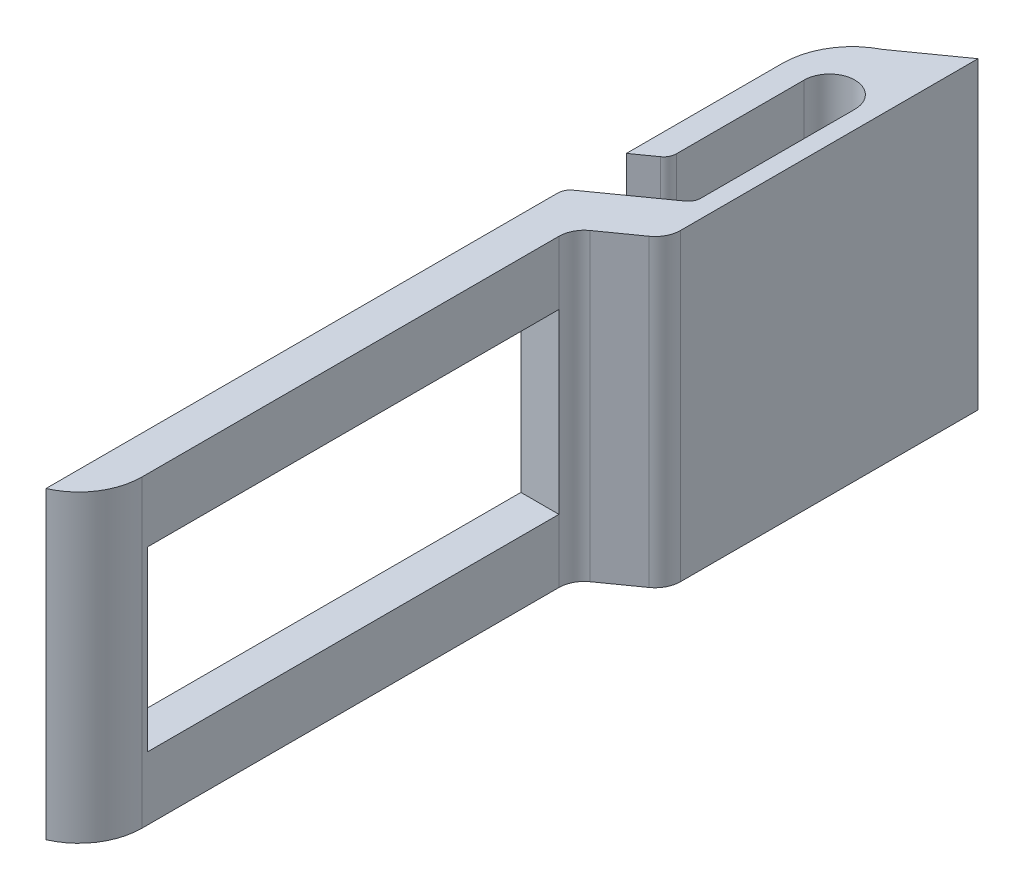
ISO-10303-21;
HEADER;
FILE_DESCRIPTION(('STEP AP214'),'2;1');
FILE_NAME('part.step','',(''),(''),'','','');
FILE_SCHEMA(('AUTOMOTIVE_DESIGN { 1 0 10303 214 1 1 1 1 }'));
ENDSEC;
DATA;
#1=APPLICATION_CONTEXT('core data for automotive mechanical design processes');
#2=APPLICATION_PROTOCOL_DEFINITION('international standard','automotive_design',2000,#1);
#3=PRODUCT_CONTEXT('',#1,'mechanical');
#4=PRODUCT('Part','Part','',(#3));
#5=PRODUCT_RELATED_PRODUCT_CATEGORY('part','',(#4));
#6=PRODUCT_DEFINITION_FORMATION('','',#4);
#7=PRODUCT_DEFINITION_CONTEXT('part definition',#1,'design');
#8=PRODUCT_DEFINITION('design','',#6,#7);
#9=PRODUCT_DEFINITION_SHAPE('','',#8);
#10=(LENGTH_UNIT() NAMED_UNIT(*) SI_UNIT(.MILLI.,.METRE.));
#11=(NAMED_UNIT(*) PLANE_ANGLE_UNIT() SI_UNIT($,.RADIAN.));
#12=(NAMED_UNIT(*) SI_UNIT($,.STERADIAN.) SOLID_ANGLE_UNIT());
#13=UNCERTAINTY_MEASURE_WITH_UNIT(LENGTH_MEASURE(1.E-05),#10,'distance_accuracy_value','');
#14=(GEOMETRIC_REPRESENTATION_CONTEXT(3) GLOBAL_UNCERTAINTY_ASSIGNED_CONTEXT((#13)) GLOBAL_UNIT_ASSIGNED_CONTEXT((#10,
#11,#12)) REPRESENTATION_CONTEXT('',''));
#15=CARTESIAN_POINT('',(0.,0.,0.));
#16=DIRECTION('',(0.,0.,1.));
#17=DIRECTION('',(1.,0.,0.));
#18=AXIS2_PLACEMENT_3D('',#15,#16,#17);
#19=CARTESIAN_POINT('',(-1.50000000000001,24.,-36.5));
#20=DIRECTION('',(1.,0.,0.));
#21=DIRECTION('',(0.,0.,-1.));
#22=AXIS2_PLACEMENT_3D('',#19,#20,#21);
#23=PLANE('',#22);
#24=DIRECTION('',(0.,0.,1.));
#25=VECTOR('',#24,1.);
#26=CARTESIAN_POINT('',(-1.50000000000001,24.,-36.5));
#27=LINE('',#26,#25);
#28=CARTESIAN_POINT('',(-1.5,24.,-31.6010205144336));
#29=VERTEX_POINT('',#28);
#30=CARTESIAN_POINT('',(-1.50000000000001,24.,-19.2916243184516));
#31=VERTEX_POINT('',#30);
#32=EDGE_CURVE('E263',#29,#31,#27,.T.);
#33=ORIENTED_EDGE('',*,*,#32,.F.);
#34=DIRECTION('',(0.,1.,0.));
#35=VECTOR('',#34,1.);
#36=CARTESIAN_POINT('',(-1.5,24.,-31.6010205144336));
#37=LINE('',#36,#35);
#38=CARTESIAN_POINT('',(-1.5,0.,-31.6010205144336));
#39=VERTEX_POINT('',#38);
#40=EDGE_CURVE('E322',#29,#39,#37,.F.);
#41=ORIENTED_EDGE('',*,*,#40,.T.);
#42=DIRECTION('',(0.,0.,1.));
#43=VECTOR('',#42,1.);
#44=CARTESIAN_POINT('',(-1.50000000000001,0.,-36.5));
#45=LINE('',#44,#43);
#46=CARTESIAN_POINT('',(-1.50000000000001,0.,-19.2916243184516));
#47=VERTEX_POINT('',#46);
#48=EDGE_CURVE('E276',#39,#47,#45,.T.);
#49=ORIENTED_EDGE('',*,*,#48,.T.);
#50=DIRECTION('',(0.,1.,0.));
#51=VECTOR('',#50,1.);
#52=CARTESIAN_POINT('',(-1.50000000000001,0.,-19.2916243184516));
#53=LINE('',#52,#51);
#54=EDGE_CURVE('E255',#47,#31,#53,.T.);
#55=ORIENTED_EDGE('',*,*,#54,.T.);
#56=EDGE_LOOP('',(#33,#41,#49,#55));
#57=FACE_BOUND('',#56,.T.);
#58=ADVANCED_FACE('F35',(#57),#23,.F.);
#59=DIRECTION('',(0.,1.,0.));
#60=VECTOR('',#59,1.);
#61=CARTESIAN_POINT('',(-1.5,24.,-10.9647589023237));
#62=LINE('',#61,#60);
#63=CARTESIAN_POINT('',(-1.5,5.,-10.9647589023237));
#64=VERTEX_POINT('',#63);
#65=CARTESIAN_POINT('',(-1.5,19.,-10.9647589023237));
#66=VERTEX_POINT('',#65);
#67=EDGE_CURVE('E213',#64,#66,#62,.T.);
#68=ORIENTED_EDGE('',*,*,#67,.T.);
#69=DIRECTION('',(0.,0.,1.));
#70=VECTOR('',#69,1.);
#71=CARTESIAN_POINT('',(-1.50000000000001,19.,-36.5));
#72=LINE('',#71,#70);
#73=CARTESIAN_POINT('',(-1.5,19.,21.5));
#74=VERTEX_POINT('',#73);
#75=EDGE_CURVE('E224',#66,#74,#72,.T.);
#76=ORIENTED_EDGE('',*,*,#75,.T.);
#77=DIRECTION('',(0.,-1.,0.));
#78=VECTOR('',#77,1.);
#79=CARTESIAN_POINT('',(-1.5,24.,21.5));
#80=LINE('',#79,#78);
#81=CARTESIAN_POINT('',(-1.5,5.,21.5));
#82=VERTEX_POINT('',#81);
#83=EDGE_CURVE('E189',#74,#82,#80,.T.);
#84=ORIENTED_EDGE('',*,*,#83,.T.);
#85=DIRECTION('',(0.,0.,-1.));
#86=VECTOR('',#85,1.);
#87=CARTESIAN_POINT('',(-1.50000000000001,5.,-36.5));
#88=LINE('',#87,#86);
#89=EDGE_CURVE('E221',#82,#64,#88,.T.);
#90=ORIENTED_EDGE('',*,*,#89,.T.);
#91=EDGE_LOOP('',(#68,#76,#84,#90));
#92=FACE_BOUND('',#91,.T.);
#93=CARTESIAN_POINT('',(-1.5,24.,-13.8679255914736));
#94=VERTEX_POINT('',#93);
#95=CARTESIAN_POINT('',(-1.5,24.,26.5));
#96=VERTEX_POINT('',#95);
#97=EDGE_CURVE('E266',#94,#96,#27,.T.);
#98=ORIENTED_EDGE('',*,*,#97,.F.);
#99=DIRECTION('',(0.,1.,0.));
#100=VECTOR('',#99,1.);
#101=CARTESIAN_POINT('',(-1.5,24.,-13.8679255914736));
#102=LINE('',#101,#100);
#103=CARTESIAN_POINT('',(-1.5,0.,-13.8679255914736));
#104=VERTEX_POINT('',#103);
#105=EDGE_CURVE('E304',#94,#104,#102,.F.);
#106=ORIENTED_EDGE('',*,*,#105,.T.);
#107=CARTESIAN_POINT('',(-1.5,0.,26.5));
#108=VERTEX_POINT('',#107);
#109=EDGE_CURVE('E258',#104,#108,#45,.T.);
#110=ORIENTED_EDGE('',*,*,#109,.T.);
#111=DIRECTION('',(0.,-1.,0.));
#112=VECTOR('',#111,1.);
#113=CARTESIAN_POINT('',(-1.5,24.,26.5));
#114=LINE('',#113,#112);
#115=EDGE_CURVE('E293',#96,#108,#114,.T.);
#116=ORIENTED_EDGE('',*,*,#115,.F.);
#117=EDGE_LOOP('',(#98,#106,#110,#116));
#118=FACE_BOUND('',#117,.T.);
#119=ADVANCED_FACE('F359',(#92,#118),#23,.F.);
#120=CARTESIAN_POINT('',(1.5,24.,-11.9968787353998));
#121=DIRECTION('',(-1.,0.,0.));
#122=DIRECTION('',(0.,0.,1.));
#123=AXIS2_PLACEMENT_3D('',#120,#121,#122);
#124=PLANE('',#123);
#125=DIRECTION('',(0.,0.,-1.));
#126=VECTOR('',#125,1.);
#127=CARTESIAN_POINT('',(1.5,24.,-11.9968787353998));
#128=LINE('',#127,#126);
#129=CARTESIAN_POINT('',(1.5,24.,21.9174243050442));
#130=VERTEX_POINT('',#129);
#131=CARTESIAN_POINT('',(1.5,24.,-10.9647589023237));
#132=VERTEX_POINT('',#131);
#133=EDGE_CURVE('E265',#130,#132,#128,.T.);
#134=ORIENTED_EDGE('',*,*,#133,.F.);
#135=DIRECTION('',(0.,-1.,0.));
#136=VECTOR('',#135,1.);
#137=CARTESIAN_POINT('',(1.5,24.,21.9174243050442));
#138=LINE('',#137,#136);
#139=CARTESIAN_POINT('',(1.5,0.,21.9174243050442));
#140=VERTEX_POINT('',#139);
#141=EDGE_CURVE('E349',#130,#140,#138,.T.);
#142=ORIENTED_EDGE('',*,*,#141,.T.);
#143=DIRECTION('',(0.,0.,-1.));
#144=VECTOR('',#143,1.);
#145=CARTESIAN_POINT('',(1.5,0.,-11.9968787353998));
#146=LINE('',#145,#144);
#147=CARTESIAN_POINT('',(1.5,0.,-10.9647589023237));
#148=VERTEX_POINT('',#147);
#149=EDGE_CURVE('E278',#140,#148,#146,.T.);
#150=ORIENTED_EDGE('',*,*,#149,.T.);
#151=DIRECTION('',(0.,-1.,0.));
#152=VECTOR('',#151,1.);
#153=CARTESIAN_POINT('',(1.5,24.,-10.9647589023237));
#154=LINE('',#153,#152);
#155=CARTESIAN_POINT('',(1.5,5.,-10.9647589023237));
#156=VERTEX_POINT('',#155);
#157=EDGE_CURVE('E335',#148,#156,#154,.F.);
#158=ORIENTED_EDGE('',*,*,#157,.T.);
#159=DIRECTION('',(0.,0.,-1.));
#160=VECTOR('',#159,1.);
#161=CARTESIAN_POINT('',(1.5,5.,-10.9647589023237));
#162=LINE('',#161,#160);
#163=CARTESIAN_POINT('',(1.5,5.,21.5));
#164=VERTEX_POINT('',#163);
#165=EDGE_CURVE('E207',#164,#156,#162,.T.);
#166=ORIENTED_EDGE('',*,*,#165,.F.);
#167=DIRECTION('',(0.,-1.,0.));
#168=VECTOR('',#167,1.);
#169=CARTESIAN_POINT('',(1.5,19.,21.5));
#170=LINE('',#169,#168);
#171=CARTESIAN_POINT('',(1.5,19.,21.5));
#172=VERTEX_POINT('',#171);
#173=EDGE_CURVE('E186',#172,#164,#170,.T.);
#174=ORIENTED_EDGE('',*,*,#173,.F.);
#175=DIRECTION('',(0.,0.,1.));
#176=VECTOR('',#175,1.);
#177=CARTESIAN_POINT('',(1.5,19.,-10.9647589023237));
#178=LINE('',#177,#176);
#179=CARTESIAN_POINT('',(1.5,19.,-10.9647589023237));
#180=VERTEX_POINT('',#179);
#181=EDGE_CURVE('E196',#180,#172,#178,.T.);
#182=ORIENTED_EDGE('',*,*,#181,.F.);
#183=EDGE_CURVE('E334',#180,#132,#154,.F.);
#184=ORIENTED_EDGE('',*,*,#183,.T.);
#185=EDGE_LOOP('',(#134,#142,#150,#158,#166,#174,#182,#184));
#186=FACE_BOUND('',#185,.T.);
#187=ADVANCED_FACE('F205',(#186),#124,.F.);
#188=CARTESIAN_POINT('',(5.9,24.,-15.1246177941162));
#189=DIRECTION('',(-0.579382316856528,0.,-0.815055906618657));
#190=DIRECTION('',(-0.815055906618657,0.,0.579382316856528));
#191=AXIS2_PLACEMENT_3D('',#188,#189,#190);
#192=PLANE('',#191);
#193=DIRECTION('',(0.815055906618657,0.,-0.579382316856528));
#194=VECTOR('',#193,1.);
#195=CARTESIAN_POINT('',(5.9,24.,-15.1246177941162));
#196=LINE('',#195,#194);
#197=CARTESIAN_POINT('',(2.34123536628694,24.,-12.594870715561));
#198=VERTEX_POINT('',#197);
#199=CARTESIAN_POINT('',(5.05876463371305,24.,-14.526625813955));
#200=VERTEX_POINT('',#199);
#201=EDGE_CURVE('E268',#198,#200,#196,.T.);
#202=ORIENTED_EDGE('',*,*,#201,.F.);
#203=DIRECTION('',(0.,-1.,0.));
#204=VECTOR('',#203,1.);
#205=CARTESIAN_POINT('',(2.34123536628694,0.,-12.594870715561));
#206=LINE('',#205,#204);
#207=CARTESIAN_POINT('',(2.34123536628694,0.,-12.594870715561));
#208=VERTEX_POINT('',#207);
#209=EDGE_CURVE('E331',#198,#208,#206,.T.);
#210=ORIENTED_EDGE('',*,*,#209,.T.);
#211=DIRECTION('',(0.815055906618657,0.,-0.579382316856528));
#212=VECTOR('',#211,1.);
#213=CARTESIAN_POINT('',(5.9,0.,-15.1246177941162));
#214=LINE('',#213,#212);
#215=CARTESIAN_POINT('',(5.05876463371305,0.,-14.526625813955));
#216=VERTEX_POINT('',#215);
#217=EDGE_CURVE('E280',#208,#216,#214,.T.);
#218=ORIENTED_EDGE('',*,*,#217,.T.);
#219=DIRECTION('',(0.,-1.,0.));
#220=VECTOR('',#219,1.);
#221=CARTESIAN_POINT('',(5.05876463371305,24.,-14.526625813955));
#222=LINE('',#221,#220);
#223=EDGE_CURVE('E329',#216,#200,#222,.F.);
#224=ORIENTED_EDGE('',*,*,#223,.T.);
#225=EDGE_LOOP('',(#202,#210,#218,#224));
#226=FACE_BOUND('',#225,.T.);
#227=ADVANCED_FACE('F368',(#226),#192,.F.);
#228=CARTESIAN_POINT('',(5.9,24.,-39.6277390587165));
#229=DIRECTION('',(-1.,0.,0.));
#230=DIRECTION('',(0.,0.,1.));
#231=AXIS2_PLACEMENT_3D('',#228,#229,#230);
#232=PLANE('',#231);
#233=DIRECTION('',(0.,0.,-1.));
#234=VECTOR('',#233,1.);
#235=CARTESIAN_POINT('',(5.9,24.,-39.6277390587165));
#236=LINE('',#235,#234);
#237=CARTESIAN_POINT('',(5.9,24.,-16.1567376271923));
#238=VERTEX_POINT('',#237);
#239=CARTESIAN_POINT('',(5.9,24.,-39.6277390587165));
#240=VERTEX_POINT('',#239);
#241=EDGE_CURVE('E271',#238,#240,#236,.T.);
#242=ORIENTED_EDGE('',*,*,#241,.F.);
#243=DIRECTION('',(0.,-1.,0.));
#244=VECTOR('',#243,1.);
#245=CARTESIAN_POINT('',(5.9,24.,-16.1567376271923));
#246=LINE('',#245,#244);
#247=CARTESIAN_POINT('',(5.9,0.,-16.1567376271923));
#248=VERTEX_POINT('',#247);
#249=EDGE_CURVE('E337',#238,#248,#246,.T.);
#250=ORIENTED_EDGE('',*,*,#249,.T.);
#251=DIRECTION('',(0.,0.,-1.));
#252=VECTOR('',#251,1.);
#253=CARTESIAN_POINT('',(5.9,0.,-39.6277390587165));
#254=LINE('',#253,#252);
#255=CARTESIAN_POINT('',(5.9,0.,-39.6277390587165));
#256=VERTEX_POINT('',#255);
#257=EDGE_CURVE('E283',#248,#256,#254,.T.);
#258=ORIENTED_EDGE('',*,*,#257,.T.);
#259=DIRECTION('',(0.,-1.,0.));
#260=VECTOR('',#259,1.);
#261=CARTESIAN_POINT('',(5.9,24.,-39.6277390587165));
#262=LINE('',#261,#260);
#263=EDGE_CURVE('E290',#240,#256,#262,.T.);
#264=ORIENTED_EDGE('',*,*,#263,.F.);
#265=EDGE_LOOP('',(#242,#250,#258,#264));
#266=FACE_BOUND('',#265,.T.);
#267=ADVANCED_FACE('F381',(#266),#232,.F.);
#268=CARTESIAN_POINT('',(1.5,24.,-36.5));
#269=DIRECTION('',(0.579382316856528,0.,0.815055906618657));
#270=DIRECTION('',(0.815055906618657,0.,-0.579382316856528));
#271=AXIS2_PLACEMENT_3D('',#268,#269,#270);
#272=PLANE('',#271);
#273=DIRECTION('',(-0.815055906618657,0.,0.579382316856528));
#274=VECTOR('',#273,1.);
#275=CARTESIAN_POINT('',(1.5,0.,-36.5));
#276=LINE('',#275,#274);
#277=CARTESIAN_POINT('',(1.5,0.,-36.5));
#278=VERTEX_POINT('',#277);
#279=EDGE_CURVE('E285',#256,#278,#276,.T.);
#280=ORIENTED_EDGE('',*,*,#279,.T.);
#281=DIRECTION('',(0.,-1.,0.));
#282=VECTOR('',#281,1.);
#283=CARTESIAN_POINT('',(1.5,24.,-36.5));
#284=LINE('',#283,#282);
#285=CARTESIAN_POINT('',(1.5,24.,-36.5));
#286=VERTEX_POINT('',#285);
#287=EDGE_CURVE('E275',#286,#278,#284,.T.);
#288=ORIENTED_EDGE('',*,*,#287,.F.);
#289=DIRECTION('',(-0.815055906618657,0.,0.579382316856528));
#290=VECTOR('',#289,1.);
#291=CARTESIAN_POINT('',(1.5,24.,-36.5));
#292=LINE('',#291,#290);
#293=EDGE_CURVE('E273',#240,#286,#292,.T.);
#294=ORIENTED_EDGE('',*,*,#293,.F.);
#295=ORIENTED_EDGE('',*,*,#263,.T.);
#296=EDGE_LOOP('',(#280,#288,#294,#295));
#297=FACE_BOUND('',#296,.T.);
#298=ADVANCED_FACE('F386',(#297),#272,.F.);
#299=CARTESIAN_POINT('',(0.,24.,0.));
#300=DIRECTION('',(0.,-1.,0.));
#301=DIRECTION('',(0.,0.,-1.));
#302=AXIS2_PLACEMENT_3D('',#299,#300,#301);
#303=PLANE('',#302);
#304=ORIENTED_EDGE('',*,*,#97,.T.);
#305=CARTESIAN_POINT('',(-3.5,24.,21.9174243050442));
#306=DIRECTION('',(0.,-1.,0.));
#307=DIRECTION('',(0.,0.,-1.));
#308=AXIS2_PLACEMENT_3D('',#305,#306,#307);
#309=CIRCLE('',#308,5.);
#310=EDGE_CURVE('E11',#96,#130,#309,.F.);
#311=ORIENTED_EDGE('',*,*,#310,.T.);
#312=ORIENTED_EDGE('',*,*,#133,.T.);
#313=CARTESIAN_POINT('',(3.5,24.,-10.9647589023237));
#314=DIRECTION('',(0.,-1.,0.));
#315=DIRECTION('',(0.,0.,-1.));
#316=AXIS2_PLACEMENT_3D('',#313,#314,#315);
#317=CIRCLE('',#316,2.);
#318=EDGE_CURVE('E347',#132,#198,#317,.T.);
#319=ORIENTED_EDGE('',*,*,#318,.T.);
#320=ORIENTED_EDGE('',*,*,#201,.T.);
#321=CARTESIAN_POINT('',(3.9,24.,-16.1567376271923));
#322=DIRECTION('',(0.,-1.,0.));
#323=DIRECTION('',(0.,0.,-1.));
#324=AXIS2_PLACEMENT_3D('',#321,#322,#323);
#325=CIRCLE('',#324,2.);
#326=EDGE_CURVE('E342',#200,#238,#325,.F.);
#327=ORIENTED_EDGE('',*,*,#326,.T.);
#328=ORIENTED_EDGE('',*,*,#241,.T.);
#329=ORIENTED_EDGE('',*,*,#293,.T.);
#330=CARTESIAN_POINT('',(4.,24.,-31.6010205144336));
#331=DIRECTION('',(0.,-1.,0.));
#332=DIRECTION('',(0.,0.,-1.));
#333=AXIS2_PLACEMENT_3D('',#330,#331,#332);
#334=CIRCLE('',#333,5.5);
#335=EDGE_CURVE('E327',#286,#29,#334,.F.);
#336=ORIENTED_EDGE('',*,*,#335,.T.);
#337=ORIENTED_EDGE('',*,*,#32,.T.);
#338=DIRECTION('',(-0.815055906618657,0.,0.579382316856529));
#339=VECTOR('',#338,1.);
#340=CARTESIAN_POINT('',(-1.50000000000001,24.,-19.2916243184516));
#341=LINE('',#340,#339);
#342=CARTESIAN_POINT('',(0.0793823168565237,24.,-20.4143279005148));
#343=VERTEX_POINT('',#342);
#344=EDGE_CURVE('E231',#343,#31,#341,.T.);
#345=ORIENTED_EDGE('',*,*,#344,.F.);
#346=CARTESIAN_POINT('',(-0.500000000000005,24.,-21.2293838071335));
#347=DIRECTION('',(0.,-1.,0.));
#348=DIRECTION('',(0.,0.,-1.));
#349=AXIS2_PLACEMENT_3D('',#346,#347,#348);
#350=CIRCLE('',#349,1.);
#351=CARTESIAN_POINT('',(0.499999999999995,24.,-21.2293838071335));
#352=VERTEX_POINT('',#351);
#353=EDGE_CURVE('E300',#343,#352,#350,.F.);
#354=ORIENTED_EDGE('',*,*,#353,.T.);
#355=DIRECTION('',(0.,0.,1.));
#356=VECTOR('',#355,1.);
#357=CARTESIAN_POINT('',(0.499999999999995,24.,-20.7133238905954));
#358=LINE('',#357,#356);
#359=CARTESIAN_POINT('',(0.499999999999995,24.,-31.3133238905954));
#360=VERTEX_POINT('',#359);
#361=EDGE_CURVE('E250',#360,#352,#358,.T.);
#362=ORIENTED_EDGE('',*,*,#361,.F.);
#363=CARTESIAN_POINT('',(2.49999999999999,24.,-31.3133238905954));
#364=DIRECTION('',(0.,1.,0.));
#365=DIRECTION('',(0.,0.,1.));
#366=AXIS2_PLACEMENT_3D('',#363,#364,#365);
#367=CIRCLE('',#366,2.);
#368=CARTESIAN_POINT('',(4.49999999999999,24.,-31.3133238905954));
#369=VERTEX_POINT('',#368);
#370=EDGE_CURVE('E247',#369,#360,#367,.T.);
#371=ORIENTED_EDGE('',*,*,#370,.F.);
#372=DIRECTION('',(0.,0.,-1.));
#373=VECTOR('',#372,1.);
#374=CARTESIAN_POINT('',(4.49999999999999,24.,-31.3133238905954));
#375=LINE('',#374,#373);
#376=CARTESIAN_POINT('',(4.5,24.,-19.1651441409813));
#377=VERTEX_POINT('',#376);
#378=EDGE_CURVE('E245',#377,#369,#375,.T.);
#379=ORIENTED_EDGE('',*,*,#378,.F.);
#380=CARTESIAN_POINT('',(3.5,24.,-19.1651441409813));
#381=DIRECTION('',(0.,-1.,0.));
#382=DIRECTION('',(0.,0.,-1.));
#383=AXIS2_PLACEMENT_3D('',#380,#381,#382);
#384=CIRCLE('',#383,1.);
#385=CARTESIAN_POINT('',(4.07938231685653,24.,-18.3500882343626));
#386=VERTEX_POINT('',#385);
#387=EDGE_CURVE('E318',#377,#386,#384,.T.);
#388=ORIENTED_EDGE('',*,*,#387,.T.);
#389=DIRECTION('',(0.815055906618656,0.,-0.57938231685653));
#390=VECTOR('',#389,1.);
#391=CARTESIAN_POINT('',(-1.5,24.,-14.3839855080117));
#392=LINE('',#391,#390);
#393=CARTESIAN_POINT('',(-1.07938231685653,24.,-14.6829814980923));
#394=VERTEX_POINT('',#393);
#395=EDGE_CURVE('E226',#394,#386,#392,.T.);
#396=ORIENTED_EDGE('',*,*,#395,.F.);
#397=CARTESIAN_POINT('',(-0.500000000000002,24.,-13.8679255914736));
#398=DIRECTION('',(0.,-1.,0.));
#399=DIRECTION('',(0.,0.,-1.));
#400=AXIS2_PLACEMENT_3D('',#397,#398,#399);
#401=CIRCLE('',#400,1.);
#402=EDGE_CURVE('E302',#394,#94,#401,.F.);
#403=ORIENTED_EDGE('',*,*,#402,.T.);
#404=EDGE_LOOP('',(#304,#311,#312,#319,#320,#327,#328,#329,#336,#337,#345,#354,#362,#371,#379,
#388,#396,#403));
#405=FACE_BOUND('',#404,.T.);
#406=ADVANCED_FACE('F362',(#405),#303,.F.);
#407=CARTESIAN_POINT('',(0.,0.,0.));
#408=DIRECTION('',(0.,-1.,0.));
#409=DIRECTION('',(0.,0.,-1.));
#410=AXIS2_PLACEMENT_3D('',#407,#408,#409);
#411=PLANE('',#410);
#412=ORIENTED_EDGE('',*,*,#149,.F.);
#413=CARTESIAN_POINT('',(-3.5,0.,21.9174243050442));
#414=DIRECTION('',(0.,-1.,0.));
#415=DIRECTION('',(0.,0.,-1.));
#416=AXIS2_PLACEMENT_3D('',#413,#414,#415);
#417=CIRCLE('',#416,5.);
#418=EDGE_CURVE('E43',#140,#108,#417,.T.);
#419=ORIENTED_EDGE('',*,*,#418,.T.);
#420=ORIENTED_EDGE('',*,*,#109,.F.);
#421=CARTESIAN_POINT('',(-0.500000000000002,0.,-13.8679255914736));
#422=DIRECTION('',(0.,-1.,0.));
#423=DIRECTION('',(0.,0.,-1.));
#424=AXIS2_PLACEMENT_3D('',#421,#422,#423);
#425=CIRCLE('',#424,1.);
#426=CARTESIAN_POINT('',(-1.07938231685653,0.,-14.6829814980923));
#427=VERTEX_POINT('',#426);
#428=EDGE_CURVE('E308',#104,#427,#425,.T.);
#429=ORIENTED_EDGE('',*,*,#428,.T.);
#430=DIRECTION('',(0.815055906618656,0.,-0.57938231685653));
#431=VECTOR('',#430,1.);
#432=CARTESIAN_POINT('',(-1.5,0.,-14.3839855080117));
#433=LINE('',#432,#431);
#434=CARTESIAN_POINT('',(4.07938231685653,0.,-18.3500882343626));
#435=VERTEX_POINT('',#434);
#436=EDGE_CURVE('E227',#427,#435,#433,.T.);
#437=ORIENTED_EDGE('',*,*,#436,.T.);
#438=CARTESIAN_POINT('',(3.5,0.,-19.1651441409813));
#439=DIRECTION('',(0.,-1.,0.));
#440=DIRECTION('',(0.,0.,-1.));
#441=AXIS2_PLACEMENT_3D('',#438,#439,#440);
#442=CIRCLE('',#441,1.);
#443=CARTESIAN_POINT('',(4.5,0.,-19.1651441409813));
#444=VERTEX_POINT('',#443);
#445=EDGE_CURVE('E320',#435,#444,#442,.F.);
#446=ORIENTED_EDGE('',*,*,#445,.T.);
#447=DIRECTION('',(0.,0.,-1.));
#448=VECTOR('',#447,1.);
#449=CARTESIAN_POINT('',(4.49999999999999,0.,-31.3133238905954));
#450=LINE('',#449,#448);
#451=CARTESIAN_POINT('',(4.49999999999999,0.,-31.3133238905954));
#452=VERTEX_POINT('',#451);
#453=EDGE_CURVE('E230',#444,#452,#450,.T.);
#454=ORIENTED_EDGE('',*,*,#453,.T.);
#455=CARTESIAN_POINT('',(2.49999999999999,0.,-31.3133238905954));
#456=DIRECTION('',(0.,1.,0.));
#457=DIRECTION('',(0.,0.,1.));
#458=AXIS2_PLACEMENT_3D('',#455,#456,#457);
#459=CIRCLE('',#458,2.);
#460=CARTESIAN_POINT('',(0.499999999999995,0.,-31.3133238905954));
#461=VERTEX_POINT('',#460);
#462=EDGE_CURVE('E233',#452,#461,#459,.T.);
#463=ORIENTED_EDGE('',*,*,#462,.T.);
#464=DIRECTION('',(0.,0.,1.));
#465=VECTOR('',#464,1.);
#466=CARTESIAN_POINT('',(0.499999999999995,0.,-20.7133238905954));
#467=LINE('',#466,#465);
#468=CARTESIAN_POINT('',(0.499999999999995,0.,-21.2293838071335));
#469=VERTEX_POINT('',#468);
#470=EDGE_CURVE('E236',#461,#469,#467,.T.);
#471=ORIENTED_EDGE('',*,*,#470,.T.);
#472=CARTESIAN_POINT('',(-0.500000000000005,0.,-21.2293838071335));
#473=DIRECTION('',(0.,-1.,0.));
#474=DIRECTION('',(0.,0.,-1.));
#475=AXIS2_PLACEMENT_3D('',#472,#473,#474);
#476=CIRCLE('',#475,1.);
#477=CARTESIAN_POINT('',(0.0793823168565237,0.,-20.4143279005148));
#478=VERTEX_POINT('',#477);
#479=EDGE_CURVE('E306',#469,#478,#476,.T.);
#480=ORIENTED_EDGE('',*,*,#479,.T.);
#481=DIRECTION('',(-0.815055906618657,0.,0.579382316856529));
#482=VECTOR('',#481,1.);
#483=CARTESIAN_POINT('',(-1.50000000000001,0.,-19.2916243184516));
#484=LINE('',#483,#482);
#485=EDGE_CURVE('E239',#478,#47,#484,.T.);
#486=ORIENTED_EDGE('',*,*,#485,.T.);
#487=ORIENTED_EDGE('',*,*,#48,.F.);
#488=CARTESIAN_POINT('',(4.,0.,-31.6010205144336));
#489=DIRECTION('',(0.,-1.,0.));
#490=DIRECTION('',(0.,0.,-1.));
#491=AXIS2_PLACEMENT_3D('',#488,#489,#490);
#492=CIRCLE('',#491,5.5);
#493=EDGE_CURVE('E325',#39,#278,#492,.T.);
#494=ORIENTED_EDGE('',*,*,#493,.T.);
#495=ORIENTED_EDGE('',*,*,#279,.F.);
#496=ORIENTED_EDGE('',*,*,#257,.F.);
#497=CARTESIAN_POINT('',(3.9,0.,-16.1567376271923));
#498=DIRECTION('',(0.,-1.,0.));
#499=DIRECTION('',(0.,0.,-1.));
#500=AXIS2_PLACEMENT_3D('',#497,#498,#499);
#501=CIRCLE('',#500,2.);
#502=EDGE_CURVE('E340',#248,#216,#501,.T.);
#503=ORIENTED_EDGE('',*,*,#502,.T.);
#504=ORIENTED_EDGE('',*,*,#217,.F.);
#505=CARTESIAN_POINT('',(3.5,0.,-10.9647589023237));
#506=DIRECTION('',(0.,-1.,0.));
#507=DIRECTION('',(0.,0.,-1.));
#508=AXIS2_PLACEMENT_3D('',#505,#506,#507);
#509=CIRCLE('',#508,2.);
#510=EDGE_CURVE('E344',#208,#148,#509,.F.);
#511=ORIENTED_EDGE('',*,*,#510,.T.);
#512=EDGE_LOOP('',(#412,#419,#420,#429,#437,#446,#454,#463,#471,#480,#486,#487,#494,#495,#496,
#503,#504,#511));
#513=FACE_BOUND('',#512,.T.);
#514=ADVANCED_FACE('F354',(#513),#411,.T.);
#515=CARTESIAN_POINT('',(-1.50000000000001,0.,-19.2916243184516));
#516=DIRECTION('',(-0.579382316856529,0.,-0.815055906618657));
#517=DIRECTION('',(-0.815055906618657,0.,0.579382316856529));
#518=AXIS2_PLACEMENT_3D('',#515,#516,#517);
#519=PLANE('',#518);
#520=ORIENTED_EDGE('',*,*,#485,.F.);
#521=DIRECTION('',(0.,1.,0.));
#522=VECTOR('',#521,1.);
#523=CARTESIAN_POINT('',(0.0793823168565235,0.,-20.4143279005148));
#524=LINE('',#523,#522);
#525=EDGE_CURVE('E313',#478,#343,#524,.T.);
#526=ORIENTED_EDGE('',*,*,#525,.T.);
#527=ORIENTED_EDGE('',*,*,#344,.T.);
#528=ORIENTED_EDGE('',*,*,#54,.F.);
#529=EDGE_LOOP('',(#520,#526,#527,#528));
#530=FACE_BOUND('',#529,.T.);
#531=ADVANCED_FACE('F400',(#530),#519,.F.);
#532=CARTESIAN_POINT('',(0.499999999999995,0.,-20.7133238905954));
#533=DIRECTION('',(-1.,0.,0.));
#534=DIRECTION('',(0.,0.,1.));
#535=AXIS2_PLACEMENT_3D('',#532,#533,#534);
#536=PLANE('',#535);
#537=ORIENTED_EDGE('',*,*,#361,.T.);
#538=DIRECTION('',(0.,1.,0.));
#539=VECTOR('',#538,1.);
#540=CARTESIAN_POINT('',(0.499999999999995,0.,-21.2293838071335));
#541=LINE('',#540,#539);
#542=EDGE_CURVE('E316',#352,#469,#541,.F.);
#543=ORIENTED_EDGE('',*,*,#542,.T.);
#544=ORIENTED_EDGE('',*,*,#470,.F.);
#545=DIRECTION('',(0.,1.,0.));
#546=VECTOR('',#545,1.);
#547=CARTESIAN_POINT('',(0.499999999999995,0.,-31.3133238905954));
#548=LINE('',#547,#546);
#549=EDGE_CURVE('E259',#461,#360,#548,.T.);
#550=ORIENTED_EDGE('',*,*,#549,.T.);
#551=EDGE_LOOP('',(#537,#543,#544,#550));
#552=FACE_BOUND('',#551,.T.);
#553=ADVANCED_FACE('F406',(#552),#536,.F.);
#554=CARTESIAN_POINT('',(2.49999999999999,0.,-31.3133238905954));
#555=DIRECTION('',(0.,1.,0.));
#556=DIRECTION('',(0.,0.,1.));
#557=AXIS2_PLACEMENT_3D('',#554,#555,#556);
#558=CYLINDRICAL_SURFACE('',#557,2.);
#559=ORIENTED_EDGE('',*,*,#370,.T.);
#560=ORIENTED_EDGE('',*,*,#549,.F.);
#561=ORIENTED_EDGE('',*,*,#462,.F.);
#562=DIRECTION('',(0.,1.,0.));
#563=VECTOR('',#562,1.);
#564=CARTESIAN_POINT('',(4.49999999999999,0.,-31.3133238905954));
#565=LINE('',#564,#563);
#566=EDGE_CURVE('E242',#452,#369,#565,.T.);
#567=ORIENTED_EDGE('',*,*,#566,.T.);
#568=EDGE_LOOP('',(#559,#560,#561,#567));
#569=FACE_BOUND('',#568,.T.);
#570=ADVANCED_FACE('F450',(#569),#558,.F.);
#571=CARTESIAN_POINT('',(4.49999999999999,0.,-31.3133238905954));
#572=DIRECTION('',(1.,0.,0.));
#573=DIRECTION('',(0.,0.,-1.));
#574=AXIS2_PLACEMENT_3D('',#571,#572,#573);
#575=PLANE('',#574);
#576=ORIENTED_EDGE('',*,*,#453,.F.);
#577=DIRECTION('',(0.,1.,0.));
#578=VECTOR('',#577,1.);
#579=CARTESIAN_POINT('',(4.5,24.,-19.1651441409813));
#580=LINE('',#579,#578);
#581=EDGE_CURVE('E310',#444,#377,#580,.T.);
#582=ORIENTED_EDGE('',*,*,#581,.T.);
#583=ORIENTED_EDGE('',*,*,#378,.T.);
#584=ORIENTED_EDGE('',*,*,#566,.F.);
#585=EDGE_LOOP('',(#576,#582,#583,#584));
#586=FACE_BOUND('',#585,.T.);
#587=ADVANCED_FACE('F435',(#586),#575,.F.);
#588=CARTESIAN_POINT('',(-1.5,0.,-14.3839855080117));
#589=DIRECTION('',(0.57938231685653,0.,0.815055906618656));
#590=DIRECTION('',(0.815055906618656,0.,-0.57938231685653));
#591=AXIS2_PLACEMENT_3D('',#588,#589,#590);
#592=PLANE('',#591);
#593=ORIENTED_EDGE('',*,*,#436,.F.);
#594=DIRECTION('',(0.,1.,0.));
#595=VECTOR('',#594,1.);
#596=CARTESIAN_POINT('',(-1.07938231685653,0.,-14.6829814980923));
#597=LINE('',#596,#595);
#598=EDGE_CURVE('E297',#427,#394,#597,.T.);
#599=ORIENTED_EDGE('',*,*,#598,.T.);
#600=ORIENTED_EDGE('',*,*,#395,.T.);
#601=DIRECTION('',(0.,1.,0.));
#602=VECTOR('',#601,1.);
#603=CARTESIAN_POINT('',(4.07938231685653,0.,-18.3500882343626));
#604=LINE('',#603,#602);
#605=EDGE_CURVE('E295',#386,#435,#604,.F.);
#606=ORIENTED_EDGE('',*,*,#605,.T.);
#607=EDGE_LOOP('',(#593,#599,#600,#606));
#608=FACE_BOUND('',#607,.T.);
#609=ADVANCED_FACE('F430',(#608),#592,.F.);
#610=CARTESIAN_POINT('',(-0.500000000000002,0.,-13.8679255914736));
#611=DIRECTION('',(0.,1.,0.));
#612=DIRECTION('',(0.,0.,1.));
#613=AXIS2_PLACEMENT_3D('',#610,#611,#612);
#614=CYLINDRICAL_SURFACE('',#613,1.);
#615=ORIENTED_EDGE('',*,*,#428,.F.);
#616=ORIENTED_EDGE('',*,*,#105,.F.);
#617=ORIENTED_EDGE('',*,*,#402,.F.);
#618=ORIENTED_EDGE('',*,*,#598,.F.);
#619=EDGE_LOOP('',(#615,#616,#617,#618));
#620=FACE_BOUND('',#619,.T.);
#621=ADVANCED_FACE('F417',(#620),#614,.T.);
#622=CARTESIAN_POINT('',(3.5,0.,-19.1651441409813));
#623=DIRECTION('',(0.,-1.,0.));
#624=DIRECTION('',(0.,0.,-1.));
#625=AXIS2_PLACEMENT_3D('',#622,#623,#624);
#626=CYLINDRICAL_SURFACE('',#625,1.);
#627=ORIENTED_EDGE('',*,*,#445,.F.);
#628=ORIENTED_EDGE('',*,*,#605,.F.);
#629=ORIENTED_EDGE('',*,*,#387,.F.);
#630=ORIENTED_EDGE('',*,*,#581,.F.);
#631=EDGE_LOOP('',(#627,#628,#629,#630));
#632=FACE_BOUND('',#631,.T.);
#633=ADVANCED_FACE('F410',(#632),#626,.F.);
#634=CARTESIAN_POINT('',(-0.500000000000005,0.,-21.2293838071335));
#635=DIRECTION('',(0.,1.,0.));
#636=DIRECTION('',(0.,0.,1.));
#637=AXIS2_PLACEMENT_3D('',#634,#635,#636);
#638=CYLINDRICAL_SURFACE('',#637,1.);
#639=ORIENTED_EDGE('',*,*,#479,.F.);
#640=ORIENTED_EDGE('',*,*,#542,.F.);
#641=ORIENTED_EDGE('',*,*,#353,.F.);
#642=ORIENTED_EDGE('',*,*,#525,.F.);
#643=EDGE_LOOP('',(#639,#640,#641,#642));
#644=FACE_BOUND('',#643,.T.);
#645=ADVANCED_FACE('F408',(#644),#638,.T.);
#646=CARTESIAN_POINT('',(4.,24.,-31.6010205144336));
#647=DIRECTION('',(0.,1.,0.));
#648=DIRECTION('',(0.,0.,1.));
#649=AXIS2_PLACEMENT_3D('',#646,#647,#648);
#650=CYLINDRICAL_SURFACE('',#649,5.5);
#651=ORIENTED_EDGE('',*,*,#335,.F.);
#652=ORIENTED_EDGE('',*,*,#287,.T.);
#653=ORIENTED_EDGE('',*,*,#493,.F.);
#654=ORIENTED_EDGE('',*,*,#40,.F.);
#655=EDGE_LOOP('',(#651,#652,#653,#654));
#656=FACE_BOUND('',#655,.T.);
#657=ADVANCED_FACE('F395',(#656),#650,.T.);
#658=CARTESIAN_POINT('',(3.5,24.,-10.9647589023237));
#659=DIRECTION('',(0.,1.,0.));
#660=DIRECTION('',(0.,0.,1.));
#661=AXIS2_PLACEMENT_3D('',#658,#659,#660);
#662=CYLINDRICAL_SURFACE('',#661,2.);
#663=ORIENTED_EDGE('',*,*,#318,.F.);
#664=ORIENTED_EDGE('',*,*,#183,.F.);
#665=DIRECTION('',(0.,1.,0.));
#666=VECTOR('',#665,1.);
#667=CARTESIAN_POINT('',(1.5,19.,-10.9647589023237));
#668=LINE('',#667,#666);
#669=EDGE_CURVE('E193',#156,#180,#668,.T.);
#670=ORIENTED_EDGE('',*,*,#669,.F.);
#671=ORIENTED_EDGE('',*,*,#157,.F.);
#672=ORIENTED_EDGE('',*,*,#510,.F.);
#673=ORIENTED_EDGE('',*,*,#209,.F.);
#674=EDGE_LOOP('',(#663,#664,#670,#671,#672,#673));
#675=FACE_BOUND('',#674,.T.);
#676=ADVANCED_FACE('F371',(#675),#662,.F.);
#677=CARTESIAN_POINT('',(3.9,24.,-16.1567376271923));
#678=DIRECTION('',(0.,-1.,0.));
#679=DIRECTION('',(0.,0.,-1.));
#680=AXIS2_PLACEMENT_3D('',#677,#678,#679);
#681=CYLINDRICAL_SURFACE('',#680,2.);
#682=ORIENTED_EDGE('',*,*,#326,.F.);
#683=ORIENTED_EDGE('',*,*,#223,.F.);
#684=ORIENTED_EDGE('',*,*,#502,.F.);
#685=ORIENTED_EDGE('',*,*,#249,.F.);
#686=EDGE_LOOP('',(#682,#683,#684,#685));
#687=FACE_BOUND('',#686,.T.);
#688=ADVANCED_FACE('F376',(#687),#681,.T.);
#689=CARTESIAN_POINT('',(-8.5,19.,-10.9647589023237));
#690=DIRECTION('',(0.,1.,0.));
#691=DIRECTION('',(0.,0.,1.));
#692=AXIS2_PLACEMENT_3D('',#689,#690,#691);
#693=PLANE('',#692);
#694=DIRECTION('',(1.,0.,0.));
#695=VECTOR('',#694,1.);
#696=CARTESIAN_POINT('',(-8.5,19.,-10.9647589023237));
#697=LINE('',#696,#695);
#698=EDGE_CURVE('E199',#66,#180,#697,.T.);
#699=ORIENTED_EDGE('',*,*,#698,.T.);
#700=ORIENTED_EDGE('',*,*,#181,.T.);
#701=DIRECTION('',(1.,0.,0.));
#702=VECTOR('',#701,1.);
#703=CARTESIAN_POINT('',(-8.5,19.,21.5));
#704=LINE('',#703,#702);
#705=EDGE_CURVE('E182',#74,#172,#704,.T.);
#706=ORIENTED_EDGE('',*,*,#705,.F.);
#707=ORIENTED_EDGE('',*,*,#75,.F.);
#708=EDGE_LOOP('',(#699,#700,#706,#707));
#709=FACE_BOUND('',#708,.T.);
#710=ADVANCED_FACE('F197',(#709),#693,.F.);
#711=CARTESIAN_POINT('',(-8.5,5.,-10.9647589023237));
#712=DIRECTION('',(0.,-1.,0.));
#713=DIRECTION('',(0.,0.,-1.));
#714=AXIS2_PLACEMENT_3D('',#711,#712,#713);
#715=PLANE('',#714);
#716=DIRECTION('',(1.,0.,0.));
#717=VECTOR('',#716,1.);
#718=CARTESIAN_POINT('',(-8.5,5.,21.5));
#719=LINE('',#718,#717);
#720=EDGE_CURVE('E192',#82,#164,#719,.T.);
#721=ORIENTED_EDGE('',*,*,#720,.T.);
#722=ORIENTED_EDGE('',*,*,#165,.T.);
#723=DIRECTION('',(1.,0.,0.));
#724=VECTOR('',#723,1.);
#725=CARTESIAN_POINT('',(-8.5,5.,-10.9647589023237));
#726=LINE('',#725,#724);
#727=EDGE_CURVE('E214',#64,#156,#726,.T.);
#728=ORIENTED_EDGE('',*,*,#727,.F.);
#729=ORIENTED_EDGE('',*,*,#89,.F.);
#730=EDGE_LOOP('',(#721,#722,#728,#729));
#731=FACE_BOUND('',#730,.T.);
#732=ADVANCED_FACE('F500',(#731),#715,.F.);
#733=CARTESIAN_POINT('',(-8.5,19.,21.5));
#734=DIRECTION('',(0.,0.,1.));
#735=DIRECTION('',(0.,-1.,0.));
#736=AXIS2_PLACEMENT_3D('',#733,#734,#735);
#737=PLANE('',#736);
#738=ORIENTED_EDGE('',*,*,#705,.T.);
#739=ORIENTED_EDGE('',*,*,#173,.T.);
#740=ORIENTED_EDGE('',*,*,#720,.F.);
#741=ORIENTED_EDGE('',*,*,#83,.F.);
#742=EDGE_LOOP('',(#738,#739,#740,#741));
#743=FACE_BOUND('',#742,.T.);
#744=ADVANCED_FACE('F184',(#743),#737,.F.);
#745=CARTESIAN_POINT('',(-8.5,19.,-10.9647589023237));
#746=DIRECTION('',(0.,0.,-1.));
#747=DIRECTION('',(-1.,0.,0.));
#748=AXIS2_PLACEMENT_3D('',#745,#746,#747);
#749=PLANE('',#748);
#750=ORIENTED_EDGE('',*,*,#727,.T.);
#751=ORIENTED_EDGE('',*,*,#669,.T.);
#752=ORIENTED_EDGE('',*,*,#698,.F.);
#753=ORIENTED_EDGE('',*,*,#67,.F.);
#754=EDGE_LOOP('',(#750,#751,#752,#753));
#755=FACE_BOUND('',#754,.T.);
#756=ADVANCED_FACE('F484',(#755),#749,.F.);
#757=CARTESIAN_POINT('',(-3.5,24.,21.9174243050442));
#758=DIRECTION('',(0.,-1.,0.));
#759=DIRECTION('',(0.,0.,-1.));
#760=AXIS2_PLACEMENT_3D('',#757,#758,#759);
#761=CYLINDRICAL_SURFACE('',#760,5.);
#762=ORIENTED_EDGE('',*,*,#310,.F.);
#763=ORIENTED_EDGE('',*,*,#115,.T.);
#764=ORIENTED_EDGE('',*,*,#418,.F.);
#765=ORIENTED_EDGE('',*,*,#141,.F.);
#766=EDGE_LOOP('',(#762,#763,#764,#765));
#767=FACE_BOUND('',#766,.T.);
#768=ADVANCED_FACE('F37',(#767),#761,.T.);
#769=CLOSED_SHELL('',(#58,#119,#187,#227,#267,#298,#406,#514,#531,#553,#570,#587,#609,#621,#633,
#645,#657,#676,#688,#710,#732,#744,#756,#768));
#770=MANIFOLD_SOLID_BREP('B2',#769);
#771=ADVANCED_BREP_SHAPE_REPRESENTATION('',(#18,#770),#14);
#772=SHAPE_DEFINITION_REPRESENTATION(#9,#771);
ENDSEC;
END-ISO-10303-21;
